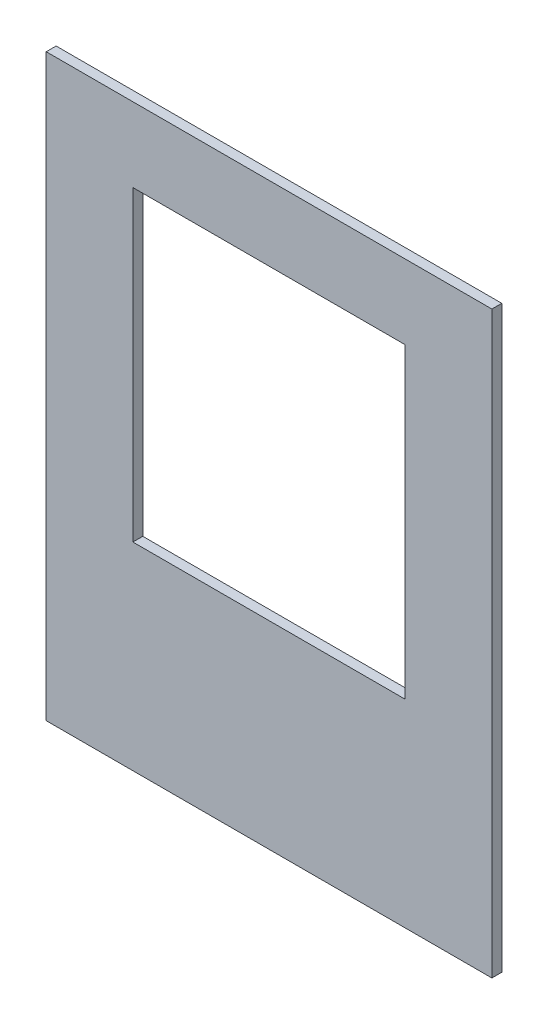
ISO-10303-21;
HEADER;
FILE_DESCRIPTION(('STEP AP214'),'2;1');
FILE_NAME('part.step','',(''),(''),'','','');
FILE_SCHEMA(('AUTOMOTIVE_DESIGN { 1 0 10303 214 1 1 1 1 }'));
ENDSEC;
DATA;
#1=APPLICATION_CONTEXT('core data for automotive mechanical design processes');
#2=APPLICATION_PROTOCOL_DEFINITION('international standard','automotive_design',2000,#1);
#3=PRODUCT_CONTEXT('',#1,'mechanical');
#4=PRODUCT('Part','Part','',(#3));
#5=PRODUCT_RELATED_PRODUCT_CATEGORY('part','',(#4));
#6=PRODUCT_DEFINITION_FORMATION('','',#4);
#7=PRODUCT_DEFINITION_CONTEXT('part definition',#1,'design');
#8=PRODUCT_DEFINITION('design','',#6,#7);
#9=PRODUCT_DEFINITION_SHAPE('','',#8);
#10=(LENGTH_UNIT() NAMED_UNIT(*) SI_UNIT(.MILLI.,.METRE.));
#11=(NAMED_UNIT(*) PLANE_ANGLE_UNIT() SI_UNIT($,.RADIAN.));
#12=(NAMED_UNIT(*) SI_UNIT($,.STERADIAN.) SOLID_ANGLE_UNIT());
#13=UNCERTAINTY_MEASURE_WITH_UNIT(LENGTH_MEASURE(1.E-05),#10,'distance_accuracy_value','');
#14=(GEOMETRIC_REPRESENTATION_CONTEXT(3) GLOBAL_UNCERTAINTY_ASSIGNED_CONTEXT((#13)) GLOBAL_UNIT_ASSIGNED_CONTEXT((#10,
#11,#12)) REPRESENTATION_CONTEXT('',''));
#15=CARTESIAN_POINT('',(0.,0.,0.));
#16=DIRECTION('',(0.,0.,1.));
#17=DIRECTION('',(1.,0.,0.));
#18=AXIS2_PLACEMENT_3D('',#15,#16,#17);
#19=CARTESIAN_POINT('',(110.,0.,8.));
#20=DIRECTION('',(-1.,0.,0.));
#21=DIRECTION('',(0.,0.,1.));
#22=AXIS2_PLACEMENT_3D('',#19,#20,#21);
#23=PLANE('',#22);
#24=DIRECTION('',(0.,1.,0.));
#25=VECTOR('',#24,1.);
#26=CARTESIAN_POINT('',(110.,0.,0.));
#27=LINE('',#26,#25);
#28=CARTESIAN_POINT('',(110.,-124.,0.));
#29=VERTEX_POINT('',#28);
#30=CARTESIAN_POINT('',(110.,124.,0.));
#31=VERTEX_POINT('',#30);
#32=EDGE_CURVE('E162',#29,#31,#27,.T.);
#33=ORIENTED_EDGE('',*,*,#32,.F.);
#34=DIRECTION('',(0.,0.,-1.));
#35=VECTOR('',#34,1.);
#36=CARTESIAN_POINT('',(110.,-124.,8.));
#37=LINE('',#36,#35);
#38=CARTESIAN_POINT('',(110.,-124.,8.));
#39=VERTEX_POINT('',#38);
#40=EDGE_CURVE('E11',#39,#29,#37,.T.);
#41=ORIENTED_EDGE('',*,*,#40,.F.);
#42=DIRECTION('',(0.,1.,0.));
#43=VECTOR('',#42,1.);
#44=CARTESIAN_POINT('',(110.,0.,8.));
#45=LINE('',#44,#43);
#46=CARTESIAN_POINT('',(110.,124.,8.));
#47=VERTEX_POINT('',#46);
#48=EDGE_CURVE('E135',#39,#47,#45,.T.);
#49=ORIENTED_EDGE('',*,*,#48,.T.);
#50=DIRECTION('',(0.,0.,-1.));
#51=VECTOR('',#50,1.);
#52=CARTESIAN_POINT('',(110.,124.,8.));
#53=LINE('',#52,#51);
#54=EDGE_CURVE('E95',#47,#31,#53,.T.);
#55=ORIENTED_EDGE('',*,*,#54,.T.);
#56=EDGE_LOOP('',(#33,#41,#49,#55));
#57=FACE_BOUND('',#56,.T.);
#58=ADVANCED_FACE('F40',(#57),#23,.T.);
#59=CARTESIAN_POINT('',(0.,-124.,8.));
#60=DIRECTION('',(0.,1.,0.));
#61=DIRECTION('',(0.,0.,1.));
#62=AXIS2_PLACEMENT_3D('',#59,#60,#61);
#63=PLANE('',#62);
#64=DIRECTION('',(1.,0.,0.));
#65=VECTOR('',#64,1.);
#66=CARTESIAN_POINT('',(0.,-124.,0.));
#67=LINE('',#66,#65);
#68=CARTESIAN_POINT('',(-110.,-124.,0.));
#69=VERTEX_POINT('',#68);
#70=EDGE_CURVE('E123',#69,#29,#67,.T.);
#71=ORIENTED_EDGE('',*,*,#70,.F.);
#72=DIRECTION('',(0.,0.,-1.));
#73=VECTOR('',#72,1.);
#74=CARTESIAN_POINT('',(-110.,-124.,8.));
#75=LINE('',#74,#73);
#76=CARTESIAN_POINT('',(-110.,-124.,8.));
#77=VERTEX_POINT('',#76);
#78=EDGE_CURVE('E51',#77,#69,#75,.T.);
#79=ORIENTED_EDGE('',*,*,#78,.F.);
#80=DIRECTION('',(1.,0.,0.));
#81=VECTOR('',#80,1.);
#82=CARTESIAN_POINT('',(0.,-124.,8.));
#83=LINE('',#82,#81);
#84=EDGE_CURVE('E121',#77,#39,#83,.T.);
#85=ORIENTED_EDGE('',*,*,#84,.T.);
#86=ORIENTED_EDGE('',*,*,#40,.T.);
#87=EDGE_LOOP('',(#71,#79,#85,#86));
#88=FACE_BOUND('',#87,.T.);
#89=ADVANCED_FACE('F119',(#88),#63,.T.);
#90=CARTESIAN_POINT('',(-110.,0.,8.));
#91=DIRECTION('',(-1.,0.,0.));
#92=DIRECTION('',(0.,0.,1.));
#93=AXIS2_PLACEMENT_3D('',#90,#91,#92);
#94=PLANE('',#93);
#95=DIRECTION('',(0.,1.,0.));
#96=VECTOR('',#95,1.);
#97=CARTESIAN_POINT('',(-110.,0.,0.));
#98=LINE('',#97,#96);
#99=CARTESIAN_POINT('',(-110.,124.,0.));
#100=VERTEX_POINT('',#99);
#101=EDGE_CURVE('E167',#69,#100,#98,.T.);
#102=ORIENTED_EDGE('',*,*,#101,.T.);
#103=DIRECTION('',(0.,0.,-1.));
#104=VECTOR('',#103,1.);
#105=CARTESIAN_POINT('',(-110.,124.,8.));
#106=LINE('',#105,#104);
#107=CARTESIAN_POINT('',(-110.,124.,8.));
#108=VERTEX_POINT('',#107);
#109=EDGE_CURVE('E127',#108,#100,#106,.T.);
#110=ORIENTED_EDGE('',*,*,#109,.F.);
#111=DIRECTION('',(0.,1.,0.));
#112=VECTOR('',#111,1.);
#113=CARTESIAN_POINT('',(-110.,0.,8.));
#114=LINE('',#113,#112);
#115=EDGE_CURVE('E130',#77,#108,#114,.T.);
#116=ORIENTED_EDGE('',*,*,#115,.F.);
#117=ORIENTED_EDGE('',*,*,#78,.T.);
#118=EDGE_LOOP('',(#102,#110,#116,#117));
#119=FACE_BOUND('',#118,.T.);
#120=ADVANCED_FACE('F131',(#119),#94,.F.);
#121=CARTESIAN_POINT('',(180.,0.,8.));
#122=DIRECTION('',(1.,0.,0.));
#123=DIRECTION('',(0.,0.,-1.));
#124=AXIS2_PLACEMENT_3D('',#121,#122,#123);
#125=PLANE('',#124);
#126=DIRECTION('',(0.,-1.,0.));
#127=VECTOR('',#126,1.);
#128=CARTESIAN_POINT('',(180.,0.,0.));
#129=LINE('',#128,#127);
#130=CARTESIAN_POINT('',(180.,184.,0.));
#131=VERTEX_POINT('',#130);
#132=CARTESIAN_POINT('',(180.,-284.,0.));
#133=VERTEX_POINT('',#132);
#134=EDGE_CURVE('E147',#131,#133,#129,.T.);
#135=ORIENTED_EDGE('',*,*,#134,.F.);
#136=DIRECTION('',(0.,0.,-1.));
#137=VECTOR('',#136,1.);
#138=CARTESIAN_POINT('',(180.,184.,8.));
#139=LINE('',#138,#137);
#140=CARTESIAN_POINT('',(180.,184.,8.));
#141=VERTEX_POINT('',#140);
#142=EDGE_CURVE('E44',#141,#131,#139,.T.);
#143=ORIENTED_EDGE('',*,*,#142,.F.);
#144=DIRECTION('',(0.,-1.,0.));
#145=VECTOR('',#144,1.);
#146=CARTESIAN_POINT('',(180.,0.,8.));
#147=LINE('',#146,#145);
#148=CARTESIAN_POINT('',(180.,-284.,8.));
#149=VERTEX_POINT('',#148);
#150=EDGE_CURVE('E172',#141,#149,#147,.T.);
#151=ORIENTED_EDGE('',*,*,#150,.T.);
#152=DIRECTION('',(0.,0.,-1.));
#153=VECTOR('',#152,1.);
#154=CARTESIAN_POINT('',(180.,-284.,8.));
#155=LINE('',#154,#153);
#156=EDGE_CURVE('E146',#149,#133,#155,.T.);
#157=ORIENTED_EDGE('',*,*,#156,.T.);
#158=EDGE_LOOP('',(#135,#143,#151,#157));
#159=FACE_BOUND('',#158,.T.);
#160=ADVANCED_FACE('F42',(#159),#125,.T.);
#161=CARTESIAN_POINT('',(0.,184.,8.));
#162=DIRECTION('',(0.,1.,0.));
#163=DIRECTION('',(0.,0.,1.));
#164=AXIS2_PLACEMENT_3D('',#161,#162,#163);
#165=PLANE('',#164);
#166=DIRECTION('',(1.,0.,0.));
#167=VECTOR('',#166,1.);
#168=CARTESIAN_POINT('',(0.,184.,0.));
#169=LINE('',#168,#167);
#170=CARTESIAN_POINT('',(-180.,184.,0.));
#171=VERTEX_POINT('',#170);
#172=EDGE_CURVE('E151',#171,#131,#169,.T.);
#173=ORIENTED_EDGE('',*,*,#172,.F.);
#174=DIRECTION('',(0.,0.,-1.));
#175=VECTOR('',#174,1.);
#176=CARTESIAN_POINT('',(-180.,184.,8.));
#177=LINE('',#176,#175);
#178=CARTESIAN_POINT('',(-180.,184.,8.));
#179=VERTEX_POINT('',#178);
#180=EDGE_CURVE('E182',#179,#171,#177,.T.);
#181=ORIENTED_EDGE('',*,*,#180,.F.);
#182=DIRECTION('',(1.,0.,0.));
#183=VECTOR('',#182,1.);
#184=CARTESIAN_POINT('',(0.,184.,8.));
#185=LINE('',#184,#183);
#186=EDGE_CURVE('E194',#179,#141,#185,.T.);
#187=ORIENTED_EDGE('',*,*,#186,.T.);
#188=ORIENTED_EDGE('',*,*,#142,.T.);
#189=EDGE_LOOP('',(#173,#181,#187,#188));
#190=FACE_BOUND('',#189,.T.);
#191=ADVANCED_FACE('F192',(#190),#165,.T.);
#192=CARTESIAN_POINT('',(-180.,0.,8.));
#193=DIRECTION('',(1.,0.,0.));
#194=DIRECTION('',(0.,1.,0.));
#195=AXIS2_PLACEMENT_3D('',#192,#193,#194);
#196=PLANE('',#195);
#197=DIRECTION('',(0.,-1.,0.));
#198=VECTOR('',#197,1.);
#199=CARTESIAN_POINT('',(-180.,0.,0.));
#200=LINE('',#199,#198);
#201=CARTESIAN_POINT('',(-180.,-284.,0.));
#202=VERTEX_POINT('',#201);
#203=EDGE_CURVE('E155',#171,#202,#200,.T.);
#204=ORIENTED_EDGE('',*,*,#203,.T.);
#205=DIRECTION('',(0.,0.,-1.));
#206=VECTOR('',#205,1.);
#207=CARTESIAN_POINT('',(-180.,-284.,8.));
#208=LINE('',#207,#206);
#209=CARTESIAN_POINT('',(-180.,-284.,8.));
#210=VERTEX_POINT('',#209);
#211=EDGE_CURVE('E179',#210,#202,#208,.T.);
#212=ORIENTED_EDGE('',*,*,#211,.F.);
#213=DIRECTION('',(0.,-1.,0.));
#214=VECTOR('',#213,1.);
#215=CARTESIAN_POINT('',(-180.,0.,8.));
#216=LINE('',#215,#214);
#217=EDGE_CURVE('E205',#179,#210,#216,.T.);
#218=ORIENTED_EDGE('',*,*,#217,.F.);
#219=ORIENTED_EDGE('',*,*,#180,.T.);
#220=EDGE_LOOP('',(#204,#212,#218,#219));
#221=FACE_BOUND('',#220,.T.);
#222=ADVANCED_FACE('F200',(#221),#196,.F.);
#223=CARTESIAN_POINT('',(0.,-284.,8.));
#224=DIRECTION('',(0.,1.,0.));
#225=DIRECTION('',(0.,0.,1.));
#226=AXIS2_PLACEMENT_3D('',#223,#224,#225);
#227=PLANE('',#226);
#228=DIRECTION('',(1.,0.,0.));
#229=VECTOR('',#228,1.);
#230=CARTESIAN_POINT('',(0.,-284.,0.));
#231=LINE('',#230,#229);
#232=EDGE_CURVE('E158',#202,#133,#231,.T.);
#233=ORIENTED_EDGE('',*,*,#232,.T.);
#234=ORIENTED_EDGE('',*,*,#156,.F.);
#235=DIRECTION('',(1.,0.,0.));
#236=VECTOR('',#235,1.);
#237=CARTESIAN_POINT('',(0.,-284.,8.));
#238=LINE('',#237,#236);
#239=EDGE_CURVE('E140',#210,#149,#238,.T.);
#240=ORIENTED_EDGE('',*,*,#239,.F.);
#241=ORIENTED_EDGE('',*,*,#211,.T.);
#242=EDGE_LOOP('',(#233,#234,#240,#241));
#243=FACE_BOUND('',#242,.T.);
#244=ADVANCED_FACE('F203',(#243),#227,.F.);
#245=CARTESIAN_POINT('',(0.,124.,8.));
#246=DIRECTION('',(0.,1.,0.));
#247=DIRECTION('',(0.,0.,1.));
#248=AXIS2_PLACEMENT_3D('',#245,#246,#247);
#249=PLANE('',#248);
#250=DIRECTION('',(1.,0.,0.));
#251=VECTOR('',#250,1.);
#252=CARTESIAN_POINT('',(0.,124.,0.));
#253=LINE('',#252,#251);
#254=EDGE_CURVE('E88',#100,#31,#253,.T.);
#255=ORIENTED_EDGE('',*,*,#254,.T.);
#256=ORIENTED_EDGE('',*,*,#54,.F.);
#257=DIRECTION('',(1.,0.,0.));
#258=VECTOR('',#257,1.);
#259=CARTESIAN_POINT('',(0.,124.,8.));
#260=LINE('',#259,#258);
#261=EDGE_CURVE('E60',#108,#47,#260,.T.);
#262=ORIENTED_EDGE('',*,*,#261,.F.);
#263=ORIENTED_EDGE('',*,*,#109,.T.);
#264=EDGE_LOOP('',(#255,#256,#262,#263));
#265=FACE_BOUND('',#264,.T.);
#266=ADVANCED_FACE('F212',(#265),#249,.F.);
#267=CARTESIAN_POINT('',(0.,0.,8.));
#268=DIRECTION('',(0.,0.,1.));
#269=DIRECTION('',(1.,0.,0.));
#270=AXIS2_PLACEMENT_3D('',#267,#268,#269);
#271=PLANE('',#270);
#272=ORIENTED_EDGE('',*,*,#150,.F.);
#273=ORIENTED_EDGE('',*,*,#186,.F.);
#274=ORIENTED_EDGE('',*,*,#217,.T.);
#275=ORIENTED_EDGE('',*,*,#239,.T.);
#276=EDGE_LOOP('',(#272,#273,#274,#275));
#277=FACE_BOUND('',#276,.T.);
#278=ORIENTED_EDGE('',*,*,#48,.F.);
#279=ORIENTED_EDGE('',*,*,#84,.F.);
#280=ORIENTED_EDGE('',*,*,#115,.T.);
#281=ORIENTED_EDGE('',*,*,#261,.T.);
#282=EDGE_LOOP('',(#278,#279,#280,#281));
#283=FACE_BOUND('',#282,.T.);
#284=ADVANCED_FACE('F134',(#277,#283),#271,.T.);
#285=CARTESIAN_POINT('',(0.,0.,0.));
#286=DIRECTION('',(0.,0.,1.));
#287=DIRECTION('',(1.,0.,0.));
#288=AXIS2_PLACEMENT_3D('',#285,#286,#287);
#289=PLANE('',#288);
#290=ORIENTED_EDGE('',*,*,#134,.T.);
#291=ORIENTED_EDGE('',*,*,#232,.F.);
#292=ORIENTED_EDGE('',*,*,#203,.F.);
#293=ORIENTED_EDGE('',*,*,#172,.T.);
#294=EDGE_LOOP('',(#290,#291,#292,#293));
#295=FACE_BOUND('',#294,.T.);
#296=ORIENTED_EDGE('',*,*,#32,.T.);
#297=ORIENTED_EDGE('',*,*,#254,.F.);
#298=ORIENTED_EDGE('',*,*,#101,.F.);
#299=ORIENTED_EDGE('',*,*,#70,.T.);
#300=EDGE_LOOP('',(#296,#297,#298,#299));
#301=FACE_BOUND('',#300,.T.);
#302=ADVANCED_FACE('F198',(#295,#301),#289,.F.);
#303=CLOSED_SHELL('',(#58,#89,#120,#160,#191,#222,#244,#266,#284,#302));
#304=MANIFOLD_SOLID_BREP('B2',#303);
#305=ADVANCED_BREP_SHAPE_REPRESENTATION('',(#18,#304),#14);
#306=SHAPE_DEFINITION_REPRESENTATION(#9,#305);
ENDSEC;
END-ISO-10303-21;
